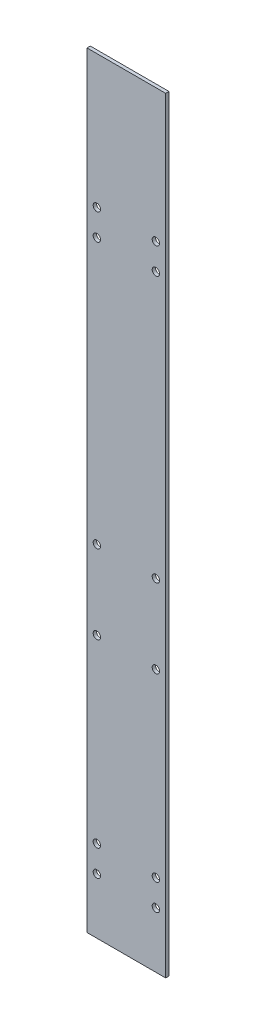
ISO-10303-21;
HEADER;
FILE_DESCRIPTION(('STEP AP214'),'2;1');
FILE_NAME('part.step','',(''),(''),'','','');
FILE_SCHEMA(('AUTOMOTIVE_DESIGN { 1 0 10303 214 1 1 1 1 }'));
ENDSEC;
DATA;
#1=APPLICATION_CONTEXT('core data for automotive mechanical design processes');
#2=APPLICATION_PROTOCOL_DEFINITION('international standard','automotive_design',2000,#1);
#3=PRODUCT_CONTEXT('',#1,'mechanical');
#4=PRODUCT('Part','Part','',(#3));
#5=PRODUCT_RELATED_PRODUCT_CATEGORY('part','',(#4));
#6=PRODUCT_DEFINITION_FORMATION('','',#4);
#7=PRODUCT_DEFINITION_CONTEXT('part definition',#1,'design');
#8=PRODUCT_DEFINITION('design','',#6,#7);
#9=PRODUCT_DEFINITION_SHAPE('','',#8);
#10=(LENGTH_UNIT() NAMED_UNIT(*) SI_UNIT(.MILLI.,.METRE.));
#11=(NAMED_UNIT(*) PLANE_ANGLE_UNIT() SI_UNIT($,.RADIAN.));
#12=(NAMED_UNIT(*) SI_UNIT($,.STERADIAN.) SOLID_ANGLE_UNIT());
#13=UNCERTAINTY_MEASURE_WITH_UNIT(LENGTH_MEASURE(1.E-05),#10,'distance_accuracy_value','');
#14=(GEOMETRIC_REPRESENTATION_CONTEXT(3) GLOBAL_UNCERTAINTY_ASSIGNED_CONTEXT((#13)) GLOBAL_UNIT_ASSIGNED_CONTEXT((#10,
#11,#12)) REPRESENTATION_CONTEXT('',''));
#15=CARTESIAN_POINT('',(0.,0.,0.));
#16=DIRECTION('',(0.,0.,1.));
#17=DIRECTION('',(1.,0.,0.));
#18=AXIS2_PLACEMENT_3D('',#15,#16,#17);
#19=CARTESIAN_POINT('',(-325.12,5935.9800001442,3.175));
#20=DIRECTION('',(-1.,0.,0.));
#21=DIRECTION('',(0.,-1.,0.));
#22=AXIS2_PLACEMENT_3D('',#19,#20,#21);
#23=PLANE('',#22);
#24=DIRECTION('',(0.,1.,0.));
#25=VECTOR('',#24,1.);
#26=CARTESIAN_POINT('',(-325.12,5935.9800001442,0.));
#27=LINE('',#26,#25);
#28=CARTESIAN_POINT('',(-325.12,5194.3,0.));
#29=VERTEX_POINT('',#28);
#30=CARTESIAN_POINT('',(-325.12,5935.9800001442,0.));
#31=VERTEX_POINT('',#30);
#32=EDGE_CURVE('E98',#29,#31,#27,.T.);
#33=ORIENTED_EDGE('',*,*,#32,.T.);
#34=DIRECTION('',(0.,0.,-1.));
#35=VECTOR('',#34,1.);
#36=CARTESIAN_POINT('',(-325.12,5935.9800001442,3.175));
#37=LINE('',#36,#35);
#38=CARTESIAN_POINT('',(-325.12,5935.9800001442,3.175));
#39=VERTEX_POINT('',#38);
#40=EDGE_CURVE('E11',#39,#31,#37,.T.);
#41=ORIENTED_EDGE('',*,*,#40,.F.);
#42=DIRECTION('',(0.,1.,0.));
#43=VECTOR('',#42,1.);
#44=CARTESIAN_POINT('',(-325.12,5935.9800001442,3.175));
#45=LINE('',#44,#43);
#46=CARTESIAN_POINT('',(-325.12,5194.3,3.175));
#47=VERTEX_POINT('',#46);
#48=EDGE_CURVE('E85',#47,#39,#45,.T.);
#49=ORIENTED_EDGE('',*,*,#48,.F.);
#50=DIRECTION('',(0.,0.,-1.));
#51=VECTOR('',#50,1.);
#52=CARTESIAN_POINT('',(-325.12,5194.3,3.175));
#53=LINE('',#52,#51);
#54=EDGE_CURVE('E94',#47,#29,#53,.T.);
#55=ORIENTED_EDGE('',*,*,#54,.T.);
#56=EDGE_LOOP('',(#33,#41,#49,#55));
#57=FACE_BOUND('',#56,.T.);
#58=ADVANCED_FACE('F32',(#57),#23,.F.);
#59=CARTESIAN_POINT('',(-325.12,5935.9800001442,3.175));
#60=DIRECTION('',(0.,-1.,0.));
#61=DIRECTION('',(0.,0.,-1.));
#62=AXIS2_PLACEMENT_3D('',#59,#60,#61);
#63=PLANE('',#62);
#64=DIRECTION('',(-1.,0.,0.));
#65=VECTOR('',#64,1.);
#66=CARTESIAN_POINT('',(-325.12,5935.9800001442,0.));
#67=LINE('',#66,#65);
#68=CARTESIAN_POINT('',(-401.32,5935.9800001442,0.));
#69=VERTEX_POINT('',#68);
#70=EDGE_CURVE('E89',#31,#69,#67,.T.);
#71=ORIENTED_EDGE('',*,*,#70,.T.);
#72=DIRECTION('',(0.,0.,-1.));
#73=VECTOR('',#72,1.);
#74=CARTESIAN_POINT('',(-401.32,5935.9800001442,3.175));
#75=LINE('',#74,#73);
#76=CARTESIAN_POINT('',(-401.32,5935.9800001442,3.175));
#77=VERTEX_POINT('',#76);
#78=EDGE_CURVE('E41',#77,#69,#75,.T.);
#79=ORIENTED_EDGE('',*,*,#78,.F.);
#80=DIRECTION('',(-1.,0.,0.));
#81=VECTOR('',#80,1.);
#82=CARTESIAN_POINT('',(-325.12,5935.9800001442,3.175));
#83=LINE('',#82,#81);
#84=EDGE_CURVE('E80',#39,#77,#83,.T.);
#85=ORIENTED_EDGE('',*,*,#84,.F.);
#86=ORIENTED_EDGE('',*,*,#40,.T.);
#87=EDGE_LOOP('',(#71,#79,#85,#86));
#88=FACE_BOUND('',#87,.T.);
#89=ADVANCED_FACE('F88',(#88),#63,.F.);
#90=CARTESIAN_POINT('',(-401.32,5935.9800001442,3.175));
#91=DIRECTION('',(1.,0.,0.));
#92=DIRECTION('',(0.,1.,0.));
#93=AXIS2_PLACEMENT_3D('',#90,#91,#92);
#94=PLANE('',#93);
#95=DIRECTION('',(0.,-1.,0.));
#96=VECTOR('',#95,1.);
#97=CARTESIAN_POINT('',(-401.32,5935.9800001442,0.));
#98=LINE('',#97,#96);
#99=CARTESIAN_POINT('',(-401.32,5194.3,0.));
#100=VERTEX_POINT('',#99);
#101=EDGE_CURVE('E67',#69,#100,#98,.T.);
#102=ORIENTED_EDGE('',*,*,#101,.T.);
#103=DIRECTION('',(0.,0.,-1.));
#104=VECTOR('',#103,1.);
#105=CARTESIAN_POINT('',(-401.32,5194.3,3.175));
#106=LINE('',#105,#104);
#107=CARTESIAN_POINT('',(-401.32,5194.3,3.175));
#108=VERTEX_POINT('',#107);
#109=EDGE_CURVE('E90',#108,#100,#106,.T.);
#110=ORIENTED_EDGE('',*,*,#109,.F.);
#111=DIRECTION('',(0.,-1.,0.));
#112=VECTOR('',#111,1.);
#113=CARTESIAN_POINT('',(-401.32,5935.9800001442,3.175));
#114=LINE('',#113,#112);
#115=EDGE_CURVE('E83',#77,#108,#114,.T.);
#116=ORIENTED_EDGE('',*,*,#115,.F.);
#117=ORIENTED_EDGE('',*,*,#78,.T.);
#118=EDGE_LOOP('',(#102,#110,#116,#117));
#119=FACE_BOUND('',#118,.T.);
#120=ADVANCED_FACE('F92',(#119),#94,.F.);
#121=CARTESIAN_POINT('',(-325.12,5194.3,3.175));
#122=DIRECTION('',(0.,1.,0.));
#123=DIRECTION('',(0.,0.,1.));
#124=AXIS2_PLACEMENT_3D('',#121,#122,#123);
#125=PLANE('',#124);
#126=DIRECTION('',(1.,0.,0.));
#127=VECTOR('',#126,1.);
#128=CARTESIAN_POINT('',(-325.12,5194.3,0.));
#129=LINE('',#128,#127);
#130=EDGE_CURVE('E73',#100,#29,#129,.T.);
#131=ORIENTED_EDGE('',*,*,#130,.T.);
#132=ORIENTED_EDGE('',*,*,#54,.F.);
#133=DIRECTION('',(1.,0.,0.));
#134=VECTOR('',#133,1.);
#135=CARTESIAN_POINT('',(-325.12,5194.3,3.175));
#136=LINE('',#135,#134);
#137=EDGE_CURVE('E50',#108,#47,#136,.T.);
#138=ORIENTED_EDGE('',*,*,#137,.F.);
#139=ORIENTED_EDGE('',*,*,#109,.T.);
#140=EDGE_LOOP('',(#131,#132,#138,#139));
#141=FACE_BOUND('',#140,.T.);
#142=ADVANCED_FACE('F189',(#141),#125,.F.);
#143=CARTESIAN_POINT('',(0.,0.,3.175));
#144=DIRECTION('',(0.,0.,-1.));
#145=DIRECTION('',(-1.,0.,0.));
#146=AXIS2_PLACEMENT_3D('',#143,#144,#145);
#147=PLANE('',#146);
#148=CARTESIAN_POINT('',(-391.795,5248.275,3.175));
#149=DIRECTION('',(0.,0.,1.));
#150=DIRECTION('',(1.,0.,0.));
#151=AXIS2_PLACEMENT_3D('',#148,#149,#150);
#152=CIRCLE('',#151,3.57123999999998);
#153=CARTESIAN_POINT('',(-388.22376,5248.275,3.175));
#154=VERTEX_POINT('',#153);
#155=EDGE_CURVE('E152',#154,#154,#152,.T.);
#156=ORIENTED_EDGE('',*,*,#155,.F.);
#157=EDGE_LOOP('',(#156));
#158=FACE_BOUND('',#157,.T.);
#159=CARTESIAN_POINT('',(-391.795,5273.675,3.175));
#160=DIRECTION('',(0.,0.,1.));
#161=DIRECTION('',(1.,0.,0.));
#162=AXIS2_PLACEMENT_3D('',#159,#160,#161);
#163=CIRCLE('',#162,3.57123999999998);
#164=CARTESIAN_POINT('',(-388.22376,5273.675,3.175));
#165=VERTEX_POINT('',#164);
#166=EDGE_CURVE('E142',#165,#165,#163,.T.);
#167=ORIENTED_EDGE('',*,*,#166,.F.);
#168=EDGE_LOOP('',(#167));
#169=FACE_BOUND('',#168,.T.);
#170=CARTESIAN_POINT('',(-334.645,5273.675,3.175));
#171=DIRECTION('',(0.,0.,1.));
#172=DIRECTION('',(1.,0.,0.));
#173=AXIS2_PLACEMENT_3D('',#170,#171,#172);
#174=CIRCLE('',#173,3.57123999999998);
#175=CARTESIAN_POINT('',(-331.07376,5273.675,3.175));
#176=VERTEX_POINT('',#175);
#177=EDGE_CURVE('E139',#176,#176,#174,.T.);
#178=ORIENTED_EDGE('',*,*,#177,.F.);
#179=EDGE_LOOP('',(#178));
#180=FACE_BOUND('',#179,.T.);
#181=CARTESIAN_POINT('',(-334.645,5248.275,3.175));
#182=DIRECTION('',(0.,0.,1.));
#183=DIRECTION('',(1.,0.,0.));
#184=AXIS2_PLACEMENT_3D('',#181,#182,#183);
#185=CIRCLE('',#184,3.57123999999998);
#186=CARTESIAN_POINT('',(-331.07376,5248.275,3.175));
#187=VERTEX_POINT('',#186);
#188=EDGE_CURVE('E136',#187,#187,#185,.T.);
#189=ORIENTED_EDGE('',*,*,#188,.F.);
#190=EDGE_LOOP('',(#189));
#191=FACE_BOUND('',#190,.T.);
#192=CARTESIAN_POINT('',(-334.645,5781.675,3.175));
#193=DIRECTION('',(0.,0.,1.));
#194=DIRECTION('',(1.,0.,0.));
#195=AXIS2_PLACEMENT_3D('',#192,#193,#194);
#196=CIRCLE('',#195,3.57123999999998);
#197=CARTESIAN_POINT('',(-331.07376,5781.675,3.175));
#198=VERTEX_POINT('',#197);
#199=EDGE_CURVE('E132',#198,#198,#196,.T.);
#200=ORIENTED_EDGE('',*,*,#199,.F.);
#201=EDGE_LOOP('',(#200));
#202=FACE_BOUND('',#201,.T.);
#203=CARTESIAN_POINT('',(-334.645,5807.075,3.175));
#204=DIRECTION('',(0.,0.,1.));
#205=DIRECTION('',(1.,0.,0.));
#206=AXIS2_PLACEMENT_3D('',#203,#204,#205);
#207=CIRCLE('',#206,3.57123999999998);
#208=CARTESIAN_POINT('',(-331.07376,5807.075,3.175));
#209=VERTEX_POINT('',#208);
#210=EDGE_CURVE('E128',#209,#209,#207,.T.);
#211=ORIENTED_EDGE('',*,*,#210,.F.);
#212=EDGE_LOOP('',(#211));
#213=FACE_BOUND('',#212,.T.);
#214=CARTESIAN_POINT('',(-391.795,5807.075,3.175));
#215=DIRECTION('',(0.,0.,1.));
#216=DIRECTION('',(1.,0.,0.));
#217=AXIS2_PLACEMENT_3D('',#214,#215,#216);
#218=CIRCLE('',#217,3.57123999999998);
#219=CARTESIAN_POINT('',(-388.22376,5807.075,3.175));
#220=VERTEX_POINT('',#219);
#221=EDGE_CURVE('E124',#220,#220,#218,.T.);
#222=ORIENTED_EDGE('',*,*,#221,.F.);
#223=EDGE_LOOP('',(#222));
#224=FACE_BOUND('',#223,.T.);
#225=CARTESIAN_POINT('',(-391.795,5781.675,3.175));
#226=DIRECTION('',(0.,0.,1.));
#227=DIRECTION('',(1.,0.,0.));
#228=AXIS2_PLACEMENT_3D('',#225,#226,#227);
#229=CIRCLE('',#228,3.57123999999998);
#230=CARTESIAN_POINT('',(-388.22376,5781.675,3.175));
#231=VERTEX_POINT('',#230);
#232=EDGE_CURVE('E120',#231,#231,#229,.T.);
#233=ORIENTED_EDGE('',*,*,#232,.F.);
#234=EDGE_LOOP('',(#233));
#235=FACE_BOUND('',#234,.T.);
#236=CARTESIAN_POINT('',(-391.795,5448.3,3.175));
#237=DIRECTION('',(0.,0.,1.));
#238=DIRECTION('',(1.,0.,0.));
#239=AXIS2_PLACEMENT_3D('',#236,#237,#238);
#240=CIRCLE('',#239,3.57123999999998);
#241=CARTESIAN_POINT('',(-388.22376,5448.3,3.175));
#242=VERTEX_POINT('',#241);
#243=EDGE_CURVE('E116',#242,#242,#240,.T.);
#244=ORIENTED_EDGE('',*,*,#243,.F.);
#245=EDGE_LOOP('',(#244));
#246=FACE_BOUND('',#245,.T.);
#247=CARTESIAN_POINT('',(-334.645,5448.3,3.175));
#248=DIRECTION('',(0.,0.,1.));
#249=DIRECTION('',(1.,0.,0.));
#250=AXIS2_PLACEMENT_3D('',#247,#248,#249);
#251=CIRCLE('',#250,3.57123999999998);
#252=CARTESIAN_POINT('',(-331.07376,5448.3,3.175));
#253=VERTEX_POINT('',#252);
#254=EDGE_CURVE('E115',#253,#253,#251,.T.);
#255=ORIENTED_EDGE('',*,*,#254,.F.);
#256=EDGE_LOOP('',(#255));
#257=FACE_BOUND('',#256,.T.);
#258=CARTESIAN_POINT('',(-391.795,5524.5,3.175));
#259=DIRECTION('',(0.,0.,1.));
#260=DIRECTION('',(1.,0.,0.));
#261=AXIS2_PLACEMENT_3D('',#258,#259,#260);
#262=CIRCLE('',#261,3.57123999999998);
#263=CARTESIAN_POINT('',(-388.22376,5524.5,3.175));
#264=VERTEX_POINT('',#263);
#265=EDGE_CURVE('E111',#264,#264,#262,.T.);
#266=ORIENTED_EDGE('',*,*,#265,.F.);
#267=EDGE_LOOP('',(#266));
#268=FACE_BOUND('',#267,.T.);
#269=CARTESIAN_POINT('',(-334.645,5524.5,3.175));
#270=DIRECTION('',(0.,0.,1.));
#271=DIRECTION('',(1.,0.,0.));
#272=AXIS2_PLACEMENT_3D('',#269,#270,#271);
#273=CIRCLE('',#272,3.57123999999998);
#274=CARTESIAN_POINT('',(-331.07376,5524.5,3.175));
#275=VERTEX_POINT('',#274);
#276=EDGE_CURVE('E110',#275,#275,#273,.T.);
#277=ORIENTED_EDGE('',*,*,#276,.F.);
#278=EDGE_LOOP('',(#277));
#279=FACE_BOUND('',#278,.T.);
#280=ORIENTED_EDGE('',*,*,#48,.T.);
#281=ORIENTED_EDGE('',*,*,#84,.T.);
#282=ORIENTED_EDGE('',*,*,#115,.T.);
#283=ORIENTED_EDGE('',*,*,#137,.T.);
#284=EDGE_LOOP('',(#280,#281,#282,#283));
#285=FACE_BOUND('',#284,.T.);
#286=ADVANCED_FACE('F81',(#158,#169,#180,#191,#202,#213,#224,#235,#246,#257,#268,#279,#285),
#147,.F.);
#287=CARTESIAN_POINT('',(0.,0.,0.));
#288=DIRECTION('',(0.,0.,-1.));
#289=DIRECTION('',(-1.,0.,0.));
#290=AXIS2_PLACEMENT_3D('',#287,#288,#289);
#291=PLANE('',#290);
#292=CARTESIAN_POINT('',(-391.795,5248.275,0.));
#293=DIRECTION('',(0.,0.,-1.));
#294=DIRECTION('',(-1.,0.,0.));
#295=AXIS2_PLACEMENT_3D('',#292,#293,#294);
#296=CIRCLE('',#295,3.57123999999998);
#297=CARTESIAN_POINT('',(-395.36624,5248.275,0.));
#298=VERTEX_POINT('',#297);
#299=EDGE_CURVE('E35',#298,#298,#296,.T.);
#300=ORIENTED_EDGE('',*,*,#299,.F.);
#301=EDGE_LOOP('',(#300));
#302=FACE_BOUND('',#301,.T.);
#303=CARTESIAN_POINT('',(-391.795,5273.675,0.));
#304=DIRECTION('',(0.,0.,-1.));
#305=DIRECTION('',(-1.,0.,0.));
#306=AXIS2_PLACEMENT_3D('',#303,#304,#305);
#307=CIRCLE('',#306,3.57123999999998);
#308=CARTESIAN_POINT('',(-395.36624,5273.675,0.));
#309=VERTEX_POINT('',#308);
#310=EDGE_CURVE('E140',#309,#309,#307,.T.);
#311=ORIENTED_EDGE('',*,*,#310,.F.);
#312=EDGE_LOOP('',(#311));
#313=FACE_BOUND('',#312,.T.);
#314=CARTESIAN_POINT('',(-334.645,5273.675,0.));
#315=DIRECTION('',(0.,0.,-1.));
#316=DIRECTION('',(-1.,0.,0.));
#317=AXIS2_PLACEMENT_3D('',#314,#315,#316);
#318=CIRCLE('',#317,3.57123999999998);
#319=CARTESIAN_POINT('',(-338.21624,5273.675,0.));
#320=VERTEX_POINT('',#319);
#321=EDGE_CURVE('E137',#320,#320,#318,.T.);
#322=ORIENTED_EDGE('',*,*,#321,.F.);
#323=EDGE_LOOP('',(#322));
#324=FACE_BOUND('',#323,.T.);
#325=CARTESIAN_POINT('',(-334.645,5248.275,0.));
#326=DIRECTION('',(0.,0.,-1.));
#327=DIRECTION('',(-1.,0.,0.));
#328=AXIS2_PLACEMENT_3D('',#325,#326,#327);
#329=CIRCLE('',#328,3.57123999999998);
#330=CARTESIAN_POINT('',(-338.21624,5248.275,0.));
#331=VERTEX_POINT('',#330);
#332=EDGE_CURVE('E133',#331,#331,#329,.T.);
#333=ORIENTED_EDGE('',*,*,#332,.F.);
#334=EDGE_LOOP('',(#333));
#335=FACE_BOUND('',#334,.T.);
#336=CARTESIAN_POINT('',(-334.645,5781.675,0.));
#337=DIRECTION('',(0.,0.,-1.));
#338=DIRECTION('',(-1.,0.,0.));
#339=AXIS2_PLACEMENT_3D('',#336,#337,#338);
#340=CIRCLE('',#339,3.57123999999998);
#341=CARTESIAN_POINT('',(-338.21624,5781.675,0.));
#342=VERTEX_POINT('',#341);
#343=EDGE_CURVE('E129',#342,#342,#340,.T.);
#344=ORIENTED_EDGE('',*,*,#343,.F.);
#345=EDGE_LOOP('',(#344));
#346=FACE_BOUND('',#345,.T.);
#347=CARTESIAN_POINT('',(-334.645,5807.075,0.));
#348=DIRECTION('',(0.,0.,-1.));
#349=DIRECTION('',(-1.,0.,0.));
#350=AXIS2_PLACEMENT_3D('',#347,#348,#349);
#351=CIRCLE('',#350,3.57123999999998);
#352=CARTESIAN_POINT('',(-338.21624,5807.075,0.));
#353=VERTEX_POINT('',#352);
#354=EDGE_CURVE('E125',#353,#353,#351,.T.);
#355=ORIENTED_EDGE('',*,*,#354,.F.);
#356=EDGE_LOOP('',(#355));
#357=FACE_BOUND('',#356,.T.);
#358=CARTESIAN_POINT('',(-391.795,5807.075,0.));
#359=DIRECTION('',(0.,0.,-1.));
#360=DIRECTION('',(-1.,0.,0.));
#361=AXIS2_PLACEMENT_3D('',#358,#359,#360);
#362=CIRCLE('',#361,3.57123999999998);
#363=CARTESIAN_POINT('',(-395.36624,5807.075,0.));
#364=VERTEX_POINT('',#363);
#365=EDGE_CURVE('E121',#364,#364,#362,.T.);
#366=ORIENTED_EDGE('',*,*,#365,.F.);
#367=EDGE_LOOP('',(#366));
#368=FACE_BOUND('',#367,.T.);
#369=CARTESIAN_POINT('',(-391.795,5781.675,0.));
#370=DIRECTION('',(0.,0.,-1.));
#371=DIRECTION('',(-1.,0.,0.));
#372=AXIS2_PLACEMENT_3D('',#369,#370,#371);
#373=CIRCLE('',#372,3.57123999999998);
#374=CARTESIAN_POINT('',(-395.36624,5781.675,0.));
#375=VERTEX_POINT('',#374);
#376=EDGE_CURVE('E117',#375,#375,#373,.T.);
#377=ORIENTED_EDGE('',*,*,#376,.F.);
#378=EDGE_LOOP('',(#377));
#379=FACE_BOUND('',#378,.T.);
#380=CARTESIAN_POINT('',(-391.795,5448.3,0.));
#381=DIRECTION('',(0.,0.,-1.));
#382=DIRECTION('',(-1.,0.,0.));
#383=AXIS2_PLACEMENT_3D('',#380,#381,#382);
#384=CIRCLE('',#383,3.57123999999998);
#385=CARTESIAN_POINT('',(-395.36624,5448.3,0.));
#386=VERTEX_POINT('',#385);
#387=EDGE_CURVE('E112',#386,#386,#384,.T.);
#388=ORIENTED_EDGE('',*,*,#387,.F.);
#389=EDGE_LOOP('',(#388));
#390=FACE_BOUND('',#389,.T.);
#391=CARTESIAN_POINT('',(-334.645,5448.3,0.));
#392=DIRECTION('',(0.,0.,-1.));
#393=DIRECTION('',(-1.,0.,0.));
#394=AXIS2_PLACEMENT_3D('',#391,#392,#393);
#395=CIRCLE('',#394,3.57123999999998);
#396=CARTESIAN_POINT('',(-338.21624,5448.3,0.));
#397=VERTEX_POINT('',#396);
#398=EDGE_CURVE('E169',#397,#397,#395,.T.);
#399=ORIENTED_EDGE('',*,*,#398,.F.);
#400=EDGE_LOOP('',(#399));
#401=FACE_BOUND('',#400,.T.);
#402=CARTESIAN_POINT('',(-391.795,5524.5,0.));
#403=DIRECTION('',(0.,0.,-1.));
#404=DIRECTION('',(-1.,0.,0.));
#405=AXIS2_PLACEMENT_3D('',#402,#403,#404);
#406=CIRCLE('',#405,3.57123999999998);
#407=CARTESIAN_POINT('',(-395.36624,5524.5,0.));
#408=VERTEX_POINT('',#407);
#409=EDGE_CURVE('E107',#408,#408,#406,.T.);
#410=ORIENTED_EDGE('',*,*,#409,.F.);
#411=EDGE_LOOP('',(#410));
#412=FACE_BOUND('',#411,.T.);
#413=CARTESIAN_POINT('',(-334.645,5524.5,0.));
#414=DIRECTION('',(0.,0.,-1.));
#415=DIRECTION('',(-1.,0.,0.));
#416=AXIS2_PLACEMENT_3D('',#413,#414,#415);
#417=CIRCLE('',#416,3.57123999999998);
#418=CARTESIAN_POINT('',(-338.21624,5524.5,0.));
#419=VERTEX_POINT('',#418);
#420=EDGE_CURVE('E101',#419,#419,#417,.T.);
#421=ORIENTED_EDGE('',*,*,#420,.F.);
#422=EDGE_LOOP('',(#421));
#423=FACE_BOUND('',#422,.T.);
#424=ORIENTED_EDGE('',*,*,#32,.F.);
#425=ORIENTED_EDGE('',*,*,#130,.F.);
#426=ORIENTED_EDGE('',*,*,#101,.F.);
#427=ORIENTED_EDGE('',*,*,#70,.F.);
#428=EDGE_LOOP('',(#424,#425,#426,#427));
#429=FACE_BOUND('',#428,.T.);
#430=ADVANCED_FACE('F182',(#302,#313,#324,#335,#346,#357,#368,#379,#390,#401,#412,#423,#429),
#291,.T.);
#431=CARTESIAN_POINT('',(-334.645,5524.5,3.175));
#432=DIRECTION('',(0.,0.,1.));
#433=DIRECTION('',(1.,0.,0.));
#434=AXIS2_PLACEMENT_3D('',#431,#432,#433);
#435=CYLINDRICAL_SURFACE('',#434,3.57123999999998);
#436=ORIENTED_EDGE('',*,*,#420,.T.);
#437=EDGE_LOOP('',(#436));
#438=FACE_BOUND('',#437,.T.);
#439=ORIENTED_EDGE('',*,*,#276,.T.);
#440=EDGE_LOOP('',(#439));
#441=FACE_BOUND('',#440,.T.);
#442=ADVANCED_FACE('F179',(#438,#441),#435,.F.);
#443=CARTESIAN_POINT('',(-391.795,5524.5,3.175));
#444=DIRECTION('',(0.,0.,1.));
#445=DIRECTION('',(1.,0.,0.));
#446=AXIS2_PLACEMENT_3D('',#443,#444,#445);
#447=CYLINDRICAL_SURFACE('',#446,3.57123999999998);
#448=ORIENTED_EDGE('',*,*,#409,.T.);
#449=EDGE_LOOP('',(#448));
#450=FACE_BOUND('',#449,.T.);
#451=ORIENTED_EDGE('',*,*,#265,.T.);
#452=EDGE_LOOP('',(#451));
#453=FACE_BOUND('',#452,.T.);
#454=ADVANCED_FACE('F230',(#450,#453),#447,.F.);
#455=CARTESIAN_POINT('',(-334.645,5448.3,3.175));
#456=DIRECTION('',(0.,0.,1.));
#457=DIRECTION('',(1.,0.,0.));
#458=AXIS2_PLACEMENT_3D('',#455,#456,#457);
#459=CYLINDRICAL_SURFACE('',#458,3.57123999999998);
#460=ORIENTED_EDGE('',*,*,#398,.T.);
#461=EDGE_LOOP('',(#460));
#462=FACE_BOUND('',#461,.T.);
#463=ORIENTED_EDGE('',*,*,#254,.T.);
#464=EDGE_LOOP('',(#463));
#465=FACE_BOUND('',#464,.T.);
#466=ADVANCED_FACE('F239',(#462,#465),#459,.F.);
#467=CARTESIAN_POINT('',(-391.795,5448.3,3.175));
#468=DIRECTION('',(0.,0.,1.));
#469=DIRECTION('',(1.,0.,0.));
#470=AXIS2_PLACEMENT_3D('',#467,#468,#469);
#471=CYLINDRICAL_SURFACE('',#470,3.57123999999998);
#472=ORIENTED_EDGE('',*,*,#387,.T.);
#473=EDGE_LOOP('',(#472));
#474=FACE_BOUND('',#473,.T.);
#475=ORIENTED_EDGE('',*,*,#243,.T.);
#476=EDGE_LOOP('',(#475));
#477=FACE_BOUND('',#476,.T.);
#478=ADVANCED_FACE('F249',(#474,#477),#471,.F.);
#479=CARTESIAN_POINT('',(-391.795,5781.675,3.175));
#480=DIRECTION('',(0.,0.,1.));
#481=DIRECTION('',(1.,0.,0.));
#482=AXIS2_PLACEMENT_3D('',#479,#480,#481);
#483=CYLINDRICAL_SURFACE('',#482,3.57123999999998);
#484=ORIENTED_EDGE('',*,*,#376,.T.);
#485=EDGE_LOOP('',(#484));
#486=FACE_BOUND('',#485,.T.);
#487=ORIENTED_EDGE('',*,*,#232,.T.);
#488=EDGE_LOOP('',(#487));
#489=FACE_BOUND('',#488,.T.);
#490=ADVANCED_FACE('F259',(#486,#489),#483,.F.);
#491=CARTESIAN_POINT('',(-391.795,5807.075,3.175));
#492=DIRECTION('',(0.,0.,1.));
#493=DIRECTION('',(1.,0.,0.));
#494=AXIS2_PLACEMENT_3D('',#491,#492,#493);
#495=CYLINDRICAL_SURFACE('',#494,3.57123999999998);
#496=ORIENTED_EDGE('',*,*,#365,.T.);
#497=EDGE_LOOP('',(#496));
#498=FACE_BOUND('',#497,.T.);
#499=ORIENTED_EDGE('',*,*,#221,.T.);
#500=EDGE_LOOP('',(#499));
#501=FACE_BOUND('',#500,.T.);
#502=ADVANCED_FACE('F269',(#498,#501),#495,.F.);
#503=CARTESIAN_POINT('',(-334.645,5807.075,3.175));
#504=DIRECTION('',(0.,0.,1.));
#505=DIRECTION('',(1.,0.,0.));
#506=AXIS2_PLACEMENT_3D('',#503,#504,#505);
#507=CYLINDRICAL_SURFACE('',#506,3.57123999999998);
#508=ORIENTED_EDGE('',*,*,#354,.T.);
#509=EDGE_LOOP('',(#508));
#510=FACE_BOUND('',#509,.T.);
#511=ORIENTED_EDGE('',*,*,#210,.T.);
#512=EDGE_LOOP('',(#511));
#513=FACE_BOUND('',#512,.T.);
#514=ADVANCED_FACE('F279',(#510,#513),#507,.F.);
#515=CARTESIAN_POINT('',(-334.645,5781.675,3.175));
#516=DIRECTION('',(0.,0.,1.));
#517=DIRECTION('',(1.,0.,0.));
#518=AXIS2_PLACEMENT_3D('',#515,#516,#517);
#519=CYLINDRICAL_SURFACE('',#518,3.57123999999998);
#520=ORIENTED_EDGE('',*,*,#343,.T.);
#521=EDGE_LOOP('',(#520));
#522=FACE_BOUND('',#521,.T.);
#523=ORIENTED_EDGE('',*,*,#199,.T.);
#524=EDGE_LOOP('',(#523));
#525=FACE_BOUND('',#524,.T.);
#526=ADVANCED_FACE('F289',(#522,#525),#519,.F.);
#527=CARTESIAN_POINT('',(-334.645,5248.275,3.175));
#528=DIRECTION('',(0.,0.,1.));
#529=DIRECTION('',(1.,0.,0.));
#530=AXIS2_PLACEMENT_3D('',#527,#528,#529);
#531=CYLINDRICAL_SURFACE('',#530,3.57123999999998);
#532=ORIENTED_EDGE('',*,*,#332,.T.);
#533=EDGE_LOOP('',(#532));
#534=FACE_BOUND('',#533,.T.);
#535=ORIENTED_EDGE('',*,*,#188,.T.);
#536=EDGE_LOOP('',(#535));
#537=FACE_BOUND('',#536,.T.);
#538=ADVANCED_FACE('F299',(#534,#537),#531,.F.);
#539=CARTESIAN_POINT('',(-334.645,5273.675,3.175));
#540=DIRECTION('',(0.,0.,1.));
#541=DIRECTION('',(1.,0.,0.));
#542=AXIS2_PLACEMENT_3D('',#539,#540,#541);
#543=CYLINDRICAL_SURFACE('',#542,3.57123999999998);
#544=ORIENTED_EDGE('',*,*,#321,.T.);
#545=EDGE_LOOP('',(#544));
#546=FACE_BOUND('',#545,.T.);
#547=ORIENTED_EDGE('',*,*,#177,.T.);
#548=EDGE_LOOP('',(#547));
#549=FACE_BOUND('',#548,.T.);
#550=ADVANCED_FACE('F309',(#546,#549),#543,.F.);
#551=CARTESIAN_POINT('',(-391.795,5273.675,3.175));
#552=DIRECTION('',(0.,0.,1.));
#553=DIRECTION('',(1.,0.,0.));
#554=AXIS2_PLACEMENT_3D('',#551,#552,#553);
#555=CYLINDRICAL_SURFACE('',#554,3.57123999999998);
#556=ORIENTED_EDGE('',*,*,#310,.T.);
#557=EDGE_LOOP('',(#556));
#558=FACE_BOUND('',#557,.T.);
#559=ORIENTED_EDGE('',*,*,#166,.T.);
#560=EDGE_LOOP('',(#559));
#561=FACE_BOUND('',#560,.T.);
#562=ADVANCED_FACE('F319',(#558,#561),#555,.F.);
#563=CARTESIAN_POINT('',(-391.795,5248.275,3.175));
#564=DIRECTION('',(0.,0.,1.));
#565=DIRECTION('',(1.,0.,0.));
#566=AXIS2_PLACEMENT_3D('',#563,#564,#565);
#567=CYLINDRICAL_SURFACE('',#566,3.57123999999998);
#568=ORIENTED_EDGE('',*,*,#299,.T.);
#569=EDGE_LOOP('',(#568));
#570=FACE_BOUND('',#569,.T.);
#571=ORIENTED_EDGE('',*,*,#155,.T.);
#572=EDGE_LOOP('',(#571));
#573=FACE_BOUND('',#572,.T.);
#574=ADVANCED_FACE('F329',(#570,#573),#567,.F.);
#575=CLOSED_SHELL('',(#58,#89,#120,#142,#286,#430,#442,#454,#466,#478,#490,#502,#514,#526,#538,
#550,#562,#574));
#576=MANIFOLD_SOLID_BREP('B2',#575);
#577=ADVANCED_BREP_SHAPE_REPRESENTATION('',(#18,#576),#14);
#578=SHAPE_DEFINITION_REPRESENTATION(#9,#577);
ENDSEC;
END-ISO-10303-21;
